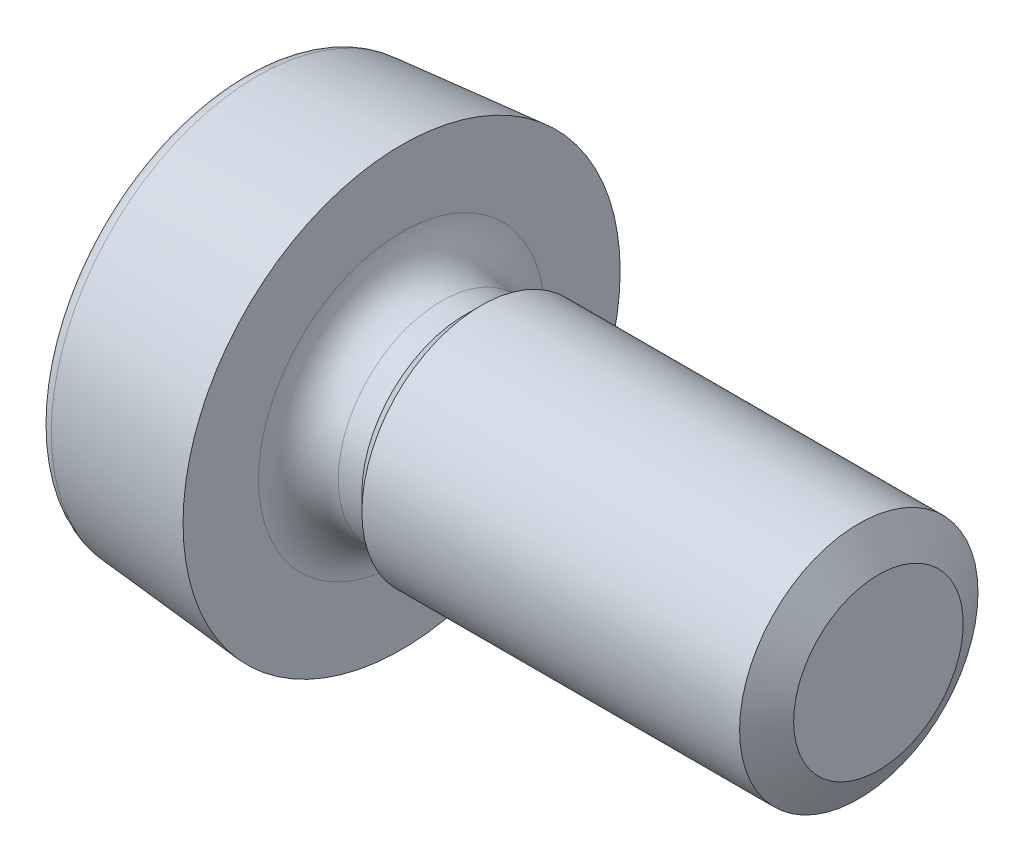
ISO-10303-21;
HEADER;
FILE_DESCRIPTION(('STEP AP214'),'2;1');
FILE_NAME('part.step','',(''),(''),'','','');
FILE_SCHEMA(('AUTOMOTIVE_DESIGN { 1 0 10303 214 1 1 1 1 }'));
ENDSEC;
DATA;
#1=APPLICATION_CONTEXT('core data for automotive mechanical design processes');
#2=APPLICATION_PROTOCOL_DEFINITION('international standard','automotive_design',2000,#1);
#3=PRODUCT_CONTEXT('',#1,'mechanical');
#4=PRODUCT('Part','Part','',(#3));
#5=PRODUCT_RELATED_PRODUCT_CATEGORY('part','',(#4));
#6=PRODUCT_DEFINITION_FORMATION('','',#4);
#7=PRODUCT_DEFINITION_CONTEXT('part definition',#1,'design');
#8=PRODUCT_DEFINITION('design','',#6,#7);
#9=PRODUCT_DEFINITION_SHAPE('','',#8);
#10=(LENGTH_UNIT() NAMED_UNIT(*) SI_UNIT(.MILLI.,.METRE.));
#11=(NAMED_UNIT(*) PLANE_ANGLE_UNIT() SI_UNIT($,.RADIAN.));
#12=(NAMED_UNIT(*) SI_UNIT($,.STERADIAN.) SOLID_ANGLE_UNIT());
#13=UNCERTAINTY_MEASURE_WITH_UNIT(LENGTH_MEASURE(1.E-05),#10,'distance_accuracy_value','');
#14=(GEOMETRIC_REPRESENTATION_CONTEXT(3) GLOBAL_UNCERTAINTY_ASSIGNED_CONTEXT((#13)) GLOBAL_UNIT_ASSIGNED_CONTEXT((#10,
#11,#12)) REPRESENTATION_CONTEXT('',''));
#15=CARTESIAN_POINT('',(0.,0.,0.));
#16=DIRECTION('',(0.,0.,1.));
#17=DIRECTION('',(1.,0.,0.));
#18=AXIS2_PLACEMENT_3D('',#15,#16,#17);
#19=CARTESIAN_POINT('',(0.,2.39175643814468,0.));
#20=DIRECTION('',(1.,0.,0.));
#21=DIRECTION('',(0.,0.,-1.));
#22=AXIS2_PLACEMENT_3D('',#19,#20,#21);
#23=PLANE('',#22);
#24=CARTESIAN_POINT('',(0.,0.,0.));
#25=DIRECTION('',(-1.,0.,0.));
#26=DIRECTION('',(0.,0.,1.));
#27=AXIS2_PLACEMENT_3D('',#24,#25,#26);
#28=CIRCLE('',#27,2.39175643814468);
#29=CARTESIAN_POINT('',(0.,0.,2.39175643814468));
#30=VERTEX_POINT('',#29);
#31=EDGE_CURVE('E171',#30,#30,#28,.T.);
#32=ORIENTED_EDGE('',*,*,#31,.T.);
#33=EDGE_LOOP('',(#32));
#34=FACE_BOUND('',#33,.T.);
#35=DIRECTION('',(0.,0.,1.));
#36=VECTOR('',#35,1.);
#37=CARTESIAN_POINT('',(0.,-0.250000000000006,1.75));
#38=LINE('',#37,#36);
#39=CARTESIAN_POINT('',(0.,-0.250000000000001,0.25));
#40=VERTEX_POINT('',#39);
#41=CARTESIAN_POINT('',(0.,-0.250000000000006,1.75));
#42=VERTEX_POINT('',#41);
#43=EDGE_CURVE('E137',#40,#42,#38,.T.);
#44=ORIENTED_EDGE('',*,*,#43,.F.);
#45=DIRECTION('',(0.,1.,0.));
#46=VECTOR('',#45,1.);
#47=CARTESIAN_POINT('',(0.,1.75,0.25));
#48=LINE('',#47,#46);
#49=CARTESIAN_POINT('',(0.,-1.75,0.25));
#50=VERTEX_POINT('',#49);
#51=EDGE_CURVE('E156',#50,#40,#48,.T.);
#52=ORIENTED_EDGE('',*,*,#51,.F.);
#53=DIRECTION('',(0.,0.,1.));
#54=VECTOR('',#53,1.);
#55=CARTESIAN_POINT('',(0.,-1.75,-0.25));
#56=LINE('',#55,#54);
#57=CARTESIAN_POINT('',(0.,-1.75,-0.25));
#58=VERTEX_POINT('',#57);
#59=EDGE_CURVE('E148',#58,#50,#56,.T.);
#60=ORIENTED_EDGE('',*,*,#59,.F.);
#61=DIRECTION('',(0.,-1.,0.));
#62=VECTOR('',#61,1.);
#63=CARTESIAN_POINT('',(0.,1.75,-0.25));
#64=LINE('',#63,#62);
#65=CARTESIAN_POINT('',(0.,-0.249999999999999,-0.25));
#66=VERTEX_POINT('',#65);
#67=EDGE_CURVE('E80',#66,#58,#64,.T.);
#68=ORIENTED_EDGE('',*,*,#67,.F.);
#69=CARTESIAN_POINT('',(0.,-0.249999999999994,-1.75));
#70=VERTEX_POINT('',#69);
#71=EDGE_CURVE('E95',#70,#66,#38,.T.);
#72=ORIENTED_EDGE('',*,*,#71,.F.);
#73=DIRECTION('',(0.,-1.,0.));
#74=VECTOR('',#73,1.);
#75=CARTESIAN_POINT('',(0.,0.250000000000006,-1.75));
#76=LINE('',#75,#74);
#77=CARTESIAN_POINT('',(0.,0.250000000000006,-1.75));
#78=VERTEX_POINT('',#77);
#79=EDGE_CURVE('E133',#78,#70,#76,.T.);
#80=ORIENTED_EDGE('',*,*,#79,.F.);
#81=DIRECTION('',(0.,0.,-1.));
#82=VECTOR('',#81,1.);
#83=CARTESIAN_POINT('',(0.,0.249999999999994,1.75));
#84=LINE('',#83,#82);
#85=CARTESIAN_POINT('',(0.,0.250000000000001,-0.25));
#86=VERTEX_POINT('',#85);
#87=EDGE_CURVE('E134',#86,#78,#84,.T.);
#88=ORIENTED_EDGE('',*,*,#87,.F.);
#89=CARTESIAN_POINT('',(0.,1.75,-0.25));
#90=VERTEX_POINT('',#89);
#91=EDGE_CURVE('E151',#90,#86,#64,.T.);
#92=ORIENTED_EDGE('',*,*,#91,.F.);
#93=DIRECTION('',(0.,0.,-1.));
#94=VECTOR('',#93,1.);
#95=CARTESIAN_POINT('',(0.,1.75,-0.25));
#96=LINE('',#95,#94);
#97=CARTESIAN_POINT('',(0.,1.75,0.25));
#98=VERTEX_POINT('',#97);
#99=EDGE_CURVE('E153',#98,#90,#96,.T.);
#100=ORIENTED_EDGE('',*,*,#99,.F.);
#101=CARTESIAN_POINT('',(0.,0.249999999999999,0.25));
#102=VERTEX_POINT('',#101);
#103=EDGE_CURVE('E65',#102,#98,#48,.T.);
#104=ORIENTED_EDGE('',*,*,#103,.F.);
#105=CARTESIAN_POINT('',(0.,0.249999999999994,1.75));
#106=VERTEX_POINT('',#105);
#107=EDGE_CURVE('E127',#106,#102,#84,.T.);
#108=ORIENTED_EDGE('',*,*,#107,.F.);
#109=DIRECTION('',(0.,1.,0.));
#110=VECTOR('',#109,1.);
#111=CARTESIAN_POINT('',(0.,0.249999999999994,1.75));
#112=LINE('',#111,#110);
#113=EDGE_CURVE('E115',#42,#106,#112,.T.);
#114=ORIENTED_EDGE('',*,*,#113,.F.);
#115=EDGE_LOOP('',(#44,#52,#60,#68,#72,#80,#88,#92,#100,#104,#108,#114));
#116=FACE_BOUND('',#115,.T.);
#117=ADVANCED_FACE('F42',(#34,#116),#23,.F.);
#118=CARTESIAN_POINT('',(0.86,0.,0.));
#119=DIRECTION('',(-0.279142362954213,0.,-0.960249728562492));
#120=DIRECTION('',(-0.960249728562492,0.,0.279142362954213));
#121=AXIS2_PLACEMENT_3D('',#118,#119,#120);
#122=PLANE('',#121);
#123=ORIENTED_EDGE('',*,*,#51,.T.);
#124=DIRECTION('',(0.924891601078248,0.268863837522747,-0.268863837522746));
#125=VECTOR('',#124,1.);
#126=CARTESIAN_POINT('',(0.86,0.,0.));
#127=LINE('',#126,#125);
#128=CARTESIAN_POINT('',(0.86,0.,0.));
#129=VERTEX_POINT('',#128);
#130=EDGE_CURVE('E87',#40,#129,#127,.T.);
#131=ORIENTED_EDGE('',*,*,#130,.T.);
#132=DIRECTION('',(0.437467884982116,0.890196277579888,-0.127170896797127));
#133=VECTOR('',#132,1.);
#134=CARTESIAN_POINT('',(0.,-1.75,0.25));
#135=LINE('',#134,#133);
#136=EDGE_CURVE('E161',#50,#129,#135,.T.);
#137=ORIENTED_EDGE('',*,*,#136,.F.);
#138=EDGE_LOOP('',(#123,#131,#137));
#139=FACE_BOUND('',#138,.T.);
#140=ADVANCED_FACE('F205',(#139),#122,.T.);
#141=DIRECTION('',(0.437467884982116,-0.890196277579888,-0.127170896797127));
#142=VECTOR('',#141,1.);
#143=CARTESIAN_POINT('',(0.,1.75,0.25));
#144=LINE('',#143,#142);
#145=EDGE_CURVE('E159',#98,#129,#144,.T.);
#146=ORIENTED_EDGE('',*,*,#145,.T.);
#147=DIRECTION('',(-0.924891601078248,0.268863837522746,0.268863837522747));
#148=VECTOR('',#147,1.);
#149=CARTESIAN_POINT('',(0.86,0.,0.));
#150=LINE('',#149,#148);
#151=EDGE_CURVE('E123',#129,#102,#150,.T.);
#152=ORIENTED_EDGE('',*,*,#151,.T.);
#153=ORIENTED_EDGE('',*,*,#103,.T.);
#154=EDGE_LOOP('',(#146,#152,#153));
#155=FACE_BOUND('',#154,.T.);
#156=ADVANCED_FACE('F198',(#155),#122,.T.);
#157=CARTESIAN_POINT('',(0.86,0.,0.));
#158=DIRECTION('',(-0.279142362954213,0.,0.960249728562492));
#159=DIRECTION('',(0.960249728562492,0.,0.279142362954213));
#160=AXIS2_PLACEMENT_3D('',#157,#158,#159);
#161=PLANE('',#160);
#162=DIRECTION('',(0.437467884982116,0.890196277579888,0.127170896797127));
#163=VECTOR('',#162,1.);
#164=CARTESIAN_POINT('',(0.,-1.75,-0.25));
#165=LINE('',#164,#163);
#166=EDGE_CURVE('E147',#58,#129,#165,.T.);
#167=ORIENTED_EDGE('',*,*,#166,.T.);
#168=DIRECTION('',(-0.924891601078248,-0.268863837522746,-0.268863837522747));
#169=VECTOR('',#168,1.);
#170=CARTESIAN_POINT('',(0.86,0.,0.));
#171=LINE('',#170,#169);
#172=EDGE_CURVE('E11',#129,#66,#171,.T.);
#173=ORIENTED_EDGE('',*,*,#172,.T.);
#174=ORIENTED_EDGE('',*,*,#67,.T.);
#175=EDGE_LOOP('',(#167,#173,#174));
#176=FACE_BOUND('',#175,.T.);
#177=ADVANCED_FACE('F199',(#176),#161,.T.);
#178=ORIENTED_EDGE('',*,*,#91,.T.);
#179=DIRECTION('',(0.924891601078248,-0.268863837522747,0.268863837522746));
#180=VECTOR('',#179,1.);
#181=CARTESIAN_POINT('',(0.86,0.,0.));
#182=LINE('',#181,#180);
#183=EDGE_CURVE('E49',#86,#129,#182,.T.);
#184=ORIENTED_EDGE('',*,*,#183,.T.);
#185=DIRECTION('',(0.437467884982116,-0.890196277579888,0.127170896797127));
#186=VECTOR('',#185,1.);
#187=CARTESIAN_POINT('',(0.,1.75,-0.25));
#188=LINE('',#187,#186);
#189=EDGE_CURVE('E56',#90,#129,#188,.T.);
#190=ORIENTED_EDGE('',*,*,#189,.F.);
#191=EDGE_LOOP('',(#178,#184,#190));
#192=FACE_BOUND('',#191,.T.);
#193=ADVANCED_FACE('F192',(#192),#161,.T.);
#194=CARTESIAN_POINT('',(-2.16958058991907,0.,0.));
#195=DIRECTION('',(-1.,0.,0.));
#196=DIRECTION('',(0.,0.,1.));
#197=AXIS2_PLACEMENT_3D('',#194,#195,#196);
#198=CYLINDRICAL_SURFACE('',#197,1.5);
#199=CARTESIAN_POINT('',(3.,0.,0.));
#200=DIRECTION('',(-1.,0.,0.));
#201=DIRECTION('',(0.,0.,1.));
#202=AXIS2_PLACEMENT_3D('',#199,#200,#201);
#203=CIRCLE('',#202,1.5);
#204=CARTESIAN_POINT('',(3.,0.,1.5));
#205=VERTEX_POINT('',#204);
#206=EDGE_CURVE('E190',#205,#205,#203,.T.);
#207=ORIENTED_EDGE('',*,*,#206,.F.);
#208=EDGE_LOOP('',(#207));
#209=FACE_BOUND('',#208,.T.);
#210=CARTESIAN_POINT('',(7.75270800287211,0.,0.));
#211=DIRECTION('',(-1.,0.,0.));
#212=DIRECTION('',(0.,0.,1.));
#213=AXIS2_PLACEMENT_3D('',#210,#211,#212);
#214=CIRCLE('',#213,1.5);
#215=CARTESIAN_POINT('',(7.75270800287211,0.,1.5));
#216=VERTEX_POINT('',#215);
#217=EDGE_CURVE('E168',#216,#216,#214,.T.);
#218=ORIENTED_EDGE('',*,*,#217,.T.);
#219=EDGE_LOOP('',(#218));
#220=FACE_BOUND('',#219,.T.);
#221=ADVANCED_FACE('F263',(#209,#220),#198,.T.);
#222=CARTESIAN_POINT('',(3.,0.,0.));
#223=DIRECTION('',(1.,0.,0.));
#224=DIRECTION('',(0.,0.,-1.));
#225=AXIS2_PLACEMENT_3D('',#222,#223,#224);
#226=CONICAL_SURFACE('',#225,1.5,0.785398163397443);
#227=CARTESIAN_POINT('',(2.799,0.,0.));
#228=DIRECTION('',(-1.,0.,0.));
#229=DIRECTION('',(0.,0.,1.));
#230=AXIS2_PLACEMENT_3D('',#227,#228,#229);
#231=CIRCLE('',#230,1.299);
#232=CARTESIAN_POINT('',(2.799,0.,1.299));
#233=VERTEX_POINT('',#232);
#234=EDGE_CURVE('E187',#233,#233,#231,.T.);
#235=ORIENTED_EDGE('',*,*,#234,.F.);
#236=EDGE_LOOP('',(#235));
#237=FACE_BOUND('',#236,.T.);
#238=ORIENTED_EDGE('',*,*,#206,.T.);
#239=EDGE_LOOP('',(#238));
#240=FACE_BOUND('',#239,.T.);
#241=ADVANCED_FACE('F257',(#237,#240),#226,.T.);
#242=CARTESIAN_POINT('',(-2.16958058991907,0.,0.));
#243=DIRECTION('',(-1.,0.,0.));
#244=DIRECTION('',(0.,0.,1.));
#245=AXIS2_PLACEMENT_3D('',#242,#243,#244);
#246=CYLINDRICAL_SURFACE('',#245,1.299);
#247=CARTESIAN_POINT('',(2.501,0.,0.));
#248=DIRECTION('',(-1.,0.,0.));
#249=DIRECTION('',(0.,0.,1.));
#250=AXIS2_PLACEMENT_3D('',#247,#248,#249);
#251=CIRCLE('',#250,1.299);
#252=CARTESIAN_POINT('',(2.501,0.,1.299));
#253=VERTEX_POINT('',#252);
#254=EDGE_CURVE('E184',#253,#253,#251,.T.);
#255=ORIENTED_EDGE('',*,*,#254,.F.);
#256=EDGE_LOOP('',(#255));
#257=FACE_BOUND('',#256,.T.);
#258=ORIENTED_EDGE('',*,*,#234,.T.);
#259=EDGE_LOOP('',(#258));
#260=FACE_BOUND('',#259,.T.);
#261=ADVANCED_FACE('F251',(#257,#260),#246,.T.);
#262=CARTESIAN_POINT('',(2.501,0.,0.));
#263=DIRECTION('',(-1.,0.,0.));
#264=DIRECTION('',(0.,0.,1.));
#265=AXIS2_PLACEMENT_3D('',#262,#263,#264);
#266=TOROIDAL_SURFACE('',#265,1.8,0.501);
#267=CARTESIAN_POINT('',(2.,0.,0.));
#268=DIRECTION('',(-1.,0.,0.));
#269=DIRECTION('',(0.,0.,1.));
#270=AXIS2_PLACEMENT_3D('',#267,#268,#269);
#271=CIRCLE('',#270,1.8);
#272=CARTESIAN_POINT('',(2.,0.,1.8));
#273=VERTEX_POINT('',#272);
#274=EDGE_CURVE('E181',#273,#273,#271,.T.);
#275=ORIENTED_EDGE('',*,*,#274,.F.);
#276=EDGE_LOOP('',(#275));
#277=FACE_BOUND('',#276,.T.);
#278=ORIENTED_EDGE('',*,*,#254,.T.);
#279=EDGE_LOOP('',(#278));
#280=FACE_BOUND('',#279,.T.);
#281=ADVANCED_FACE('F245',(#277,#280),#266,.F.);
#282=CARTESIAN_POINT('',(2.,1.8,0.));
#283=DIRECTION('',(-1.,0.,0.));
#284=DIRECTION('',(0.,0.,1.));
#285=AXIS2_PLACEMENT_3D('',#282,#283,#284);
#286=PLANE('',#285);
#287=CARTESIAN_POINT('',(2.,0.,0.));
#288=DIRECTION('',(-1.,0.,0.));
#289=DIRECTION('',(0.,0.,1.));
#290=AXIS2_PLACEMENT_3D('',#287,#288,#289);
#291=CIRCLE('',#290,2.75);
#292=CARTESIAN_POINT('',(2.,0.,2.75));
#293=VERTEX_POINT('',#292);
#294=EDGE_CURVE('E177',#293,#293,#291,.T.);
#295=ORIENTED_EDGE('',*,*,#294,.F.);
#296=EDGE_LOOP('',(#295));
#297=FACE_BOUND('',#296,.T.);
#298=ORIENTED_EDGE('',*,*,#274,.T.);
#299=EDGE_LOOP('',(#298));
#300=FACE_BOUND('',#299,.T.);
#301=ADVANCED_FACE('F239',(#297,#300),#286,.F.);
#302=CARTESIAN_POINT('',(2.,0.,0.));
#303=DIRECTION('',(1.,0.,0.));
#304=DIRECTION('',(0.,0.,-1.));
#305=AXIS2_PLACEMENT_3D('',#302,#303,#304);
#306=CONICAL_SURFACE('',#305,2.75,0.08726646259971);
#307=CARTESIAN_POINT('',(0.18256885145047,0.,0.));
#308=DIRECTION('',(-1.,0.,0.));
#309=DIRECTION('',(0.,0.,1.));
#310=AXIS2_PLACEMENT_3D('',#307,#308,#309);
#311=CIRCLE('',#310,2.59099537776303);
#312=CARTESIAN_POINT('',(0.18256885145047,0.,2.59099537776303));
#313=VERTEX_POINT('',#312);
#314=EDGE_CURVE('E174',#313,#313,#311,.T.);
#315=ORIENTED_EDGE('',*,*,#314,.F.);
#316=EDGE_LOOP('',(#315));
#317=FACE_BOUND('',#316,.T.);
#318=ORIENTED_EDGE('',*,*,#294,.T.);
#319=EDGE_LOOP('',(#318));
#320=FACE_BOUND('',#319,.T.);
#321=ADVANCED_FACE('F233',(#317,#320),#306,.T.);
#322=CARTESIAN_POINT('',(0.2,0.,0.));
#323=DIRECTION('',(-1.,0.,0.));
#324=DIRECTION('',(0.,0.,1.));
#325=AXIS2_PLACEMENT_3D('',#322,#323,#324);
#326=TOROIDAL_SURFACE('',#325,2.39175643814468,0.2);
#327=ORIENTED_EDGE('',*,*,#31,.F.);
#328=EDGE_LOOP('',(#327));
#329=FACE_BOUND('',#328,.T.);
#330=ORIENTED_EDGE('',*,*,#314,.T.);
#331=EDGE_LOOP('',(#330));
#332=FACE_BOUND('',#331,.T.);
#333=ADVANCED_FACE('F229',(#329,#332),#326,.T.);
#334=CARTESIAN_POINT('',(7.75270800287211,0.,0.));
#335=DIRECTION('',(-1.,0.,0.));
#336=DIRECTION('',(0.,0.,1.));
#337=AXIS2_PLACEMENT_3D('',#334,#335,#336);
#338=CONICAL_SURFACE('',#337,1.5,1.05188801855287);
#339=CARTESIAN_POINT('',(8.,0.,0.));
#340=DIRECTION('',(-1.,0.,0.));
#341=DIRECTION('',(0.,0.,1.));
#342=AXIS2_PLACEMENT_3D('',#339,#340,#341);
#343=CIRCLE('',#342,1.067);
#344=CARTESIAN_POINT('',(8.,0.,1.067));
#345=VERTEX_POINT('',#344);
#346=EDGE_CURVE('E155',#345,#345,#343,.T.);
#347=ORIENTED_EDGE('',*,*,#346,.T.);
#348=EDGE_LOOP('',(#347));
#349=FACE_BOUND('',#348,.T.);
#350=ORIENTED_EDGE('',*,*,#217,.F.);
#351=EDGE_LOOP('',(#350));
#352=FACE_BOUND('',#351,.T.);
#353=ADVANCED_FACE('F232',(#349,#352),#338,.T.);
#354=CARTESIAN_POINT('',(8.,0.,0.));
#355=DIRECTION('',(-1.,0.,0.));
#356=DIRECTION('',(0.,0.,1.));
#357=AXIS2_PLACEMENT_3D('',#354,#355,#356);
#358=PLANE('',#357);
#359=ORIENTED_EDGE('',*,*,#346,.F.);
#360=EDGE_LOOP('',(#359));
#361=FACE_BOUND('',#360,.T.);
#362=ADVANCED_FACE('F273',(#361),#358,.F.);
#363=CARTESIAN_POINT('',(0.,1.75,0.25));
#364=DIRECTION('',(0.897483103574347,0.441048839470822,0.));
#365=DIRECTION('',(-0.441048839470822,0.897483103574347,0.));
#366=AXIS2_PLACEMENT_3D('',#363,#364,#365);
#367=PLANE('',#366);
#368=ORIENTED_EDGE('',*,*,#145,.F.);
#369=ORIENTED_EDGE('',*,*,#99,.T.);
#370=ORIENTED_EDGE('',*,*,#189,.T.);
#371=EDGE_LOOP('',(#368,#369,#370));
#372=FACE_BOUND('',#371,.T.);
#373=ADVANCED_FACE('F197',(#372),#367,.F.);
#374=CARTESIAN_POINT('',(0.,-1.75,-0.25));
#375=DIRECTION('',(0.897483103574347,-0.441048839470822,0.));
#376=DIRECTION('',(0.441048839470822,0.897483103574347,0.));
#377=AXIS2_PLACEMENT_3D('',#374,#375,#376);
#378=PLANE('',#377);
#379=ORIENTED_EDGE('',*,*,#166,.F.);
#380=ORIENTED_EDGE('',*,*,#59,.T.);
#381=ORIENTED_EDGE('',*,*,#136,.T.);
#382=EDGE_LOOP('',(#379,#380,#381));
#383=FACE_BOUND('',#382,.T.);
#384=ADVANCED_FACE('F202',(#383),#378,.F.);
#385=CARTESIAN_POINT('',(0.86,0.,0.));
#386=DIRECTION('',(-0.279142362954213,0.960249728562492,0.));
#387=DIRECTION('',(-0.960249728562492,-0.279142362954213,0.));
#388=AXIS2_PLACEMENT_3D('',#385,#386,#387);
#389=PLANE('',#388);
#390=DIRECTION('',(0.437467884982116,0.127170896797124,0.890196277579888));
#391=VECTOR('',#390,1.);
#392=CARTESIAN_POINT('',(0.,-0.249999999999994,-1.75));
#393=LINE('',#392,#391);
#394=EDGE_CURVE('E129',#70,#129,#393,.T.);
#395=ORIENTED_EDGE('',*,*,#394,.F.);
#396=ORIENTED_EDGE('',*,*,#71,.T.);
#397=ORIENTED_EDGE('',*,*,#172,.F.);
#398=EDGE_LOOP('',(#395,#396,#397));
#399=FACE_BOUND('',#398,.T.);
#400=ADVANCED_FACE('F210',(#399),#389,.T.);
#401=CARTESIAN_POINT('',(0.86,0.,0.));
#402=DIRECTION('',(-0.279142362954213,-0.960249728562492,0.));
#403=DIRECTION('',(0.960249728562492,-0.279142362954213,0.));
#404=AXIS2_PLACEMENT_3D('',#401,#402,#403);
#405=PLANE('',#404);
#406=ORIENTED_EDGE('',*,*,#87,.T.);
#407=DIRECTION('',(0.437467884982116,-0.12717089679713,0.890196277579887));
#408=VECTOR('',#407,1.);
#409=CARTESIAN_POINT('',(0.,0.250000000000006,-1.75));
#410=LINE('',#409,#408);
#411=EDGE_CURVE('E130',#78,#129,#410,.T.);
#412=ORIENTED_EDGE('',*,*,#411,.T.);
#413=ORIENTED_EDGE('',*,*,#183,.F.);
#414=EDGE_LOOP('',(#406,#412,#413));
#415=FACE_BOUND('',#414,.T.);
#416=ADVANCED_FACE('F216',(#415),#405,.T.);
#417=CARTESIAN_POINT('',(0.,0.250000000000006,-1.75));
#418=DIRECTION('',(0.897483103574347,0.,-0.441048839470822));
#419=DIRECTION('',(0.441048839470822,0.,0.897483103574347));
#420=AXIS2_PLACEMENT_3D('',#417,#418,#419);
#421=PLANE('',#420);
#422=ORIENTED_EDGE('',*,*,#411,.F.);
#423=ORIENTED_EDGE('',*,*,#79,.T.);
#424=ORIENTED_EDGE('',*,*,#394,.T.);
#425=EDGE_LOOP('',(#422,#423,#424));
#426=FACE_BOUND('',#425,.T.);
#427=ADVANCED_FACE('F208',(#426),#421,.F.);
#428=ORIENTED_EDGE('',*,*,#43,.T.);
#429=DIRECTION('',(0.437467884982116,0.12717089679713,-0.890196277579887));
#430=VECTOR('',#429,1.);
#431=CARTESIAN_POINT('',(0.,-0.250000000000006,1.75));
#432=LINE('',#431,#430);
#433=EDGE_CURVE('E120',#42,#129,#432,.T.);
#434=ORIENTED_EDGE('',*,*,#433,.T.);
#435=ORIENTED_EDGE('',*,*,#130,.F.);
#436=EDGE_LOOP('',(#428,#434,#435));
#437=FACE_BOUND('',#436,.T.);
#438=ADVANCED_FACE('F206',(#437),#389,.T.);
#439=DIRECTION('',(0.437467884982116,-0.127170896797124,-0.890196277579888));
#440=VECTOR('',#439,1.);
#441=CARTESIAN_POINT('',(0.,0.249999999999994,1.75));
#442=LINE('',#441,#440);
#443=EDGE_CURVE('E118',#106,#129,#442,.T.);
#444=ORIENTED_EDGE('',*,*,#443,.F.);
#445=ORIENTED_EDGE('',*,*,#107,.T.);
#446=ORIENTED_EDGE('',*,*,#151,.F.);
#447=EDGE_LOOP('',(#444,#445,#446));
#448=FACE_BOUND('',#447,.T.);
#449=ADVANCED_FACE('F126',(#448),#405,.T.);
#450=CARTESIAN_POINT('',(0.,-0.250000000000006,1.75));
#451=DIRECTION('',(0.897483103574347,0.,0.441048839470822));
#452=DIRECTION('',(-0.441048839470822,0.,0.897483103574347));
#453=AXIS2_PLACEMENT_3D('',#450,#451,#452);
#454=PLANE('',#453);
#455=ORIENTED_EDGE('',*,*,#433,.F.);
#456=ORIENTED_EDGE('',*,*,#113,.T.);
#457=ORIENTED_EDGE('',*,*,#443,.T.);
#458=EDGE_LOOP('',(#455,#456,#457));
#459=FACE_BOUND('',#458,.T.);
#460=ADVANCED_FACE('F117',(#459),#454,.F.);
#461=CLOSED_SHELL('',(#117,#140,#156,#177,#193,#221,#241,#261,#281,#301,#321,#333,#353,#362,
#373,#384,#400,#416,#427,#438,#449,#460));
#462=MANIFOLD_SOLID_BREP('B2',#461);
#463=ADVANCED_BREP_SHAPE_REPRESENTATION('',(#18,#462),#14);
#464=SHAPE_DEFINITION_REPRESENTATION(#9,#463);
ENDSEC;
END-ISO-10303-21;
